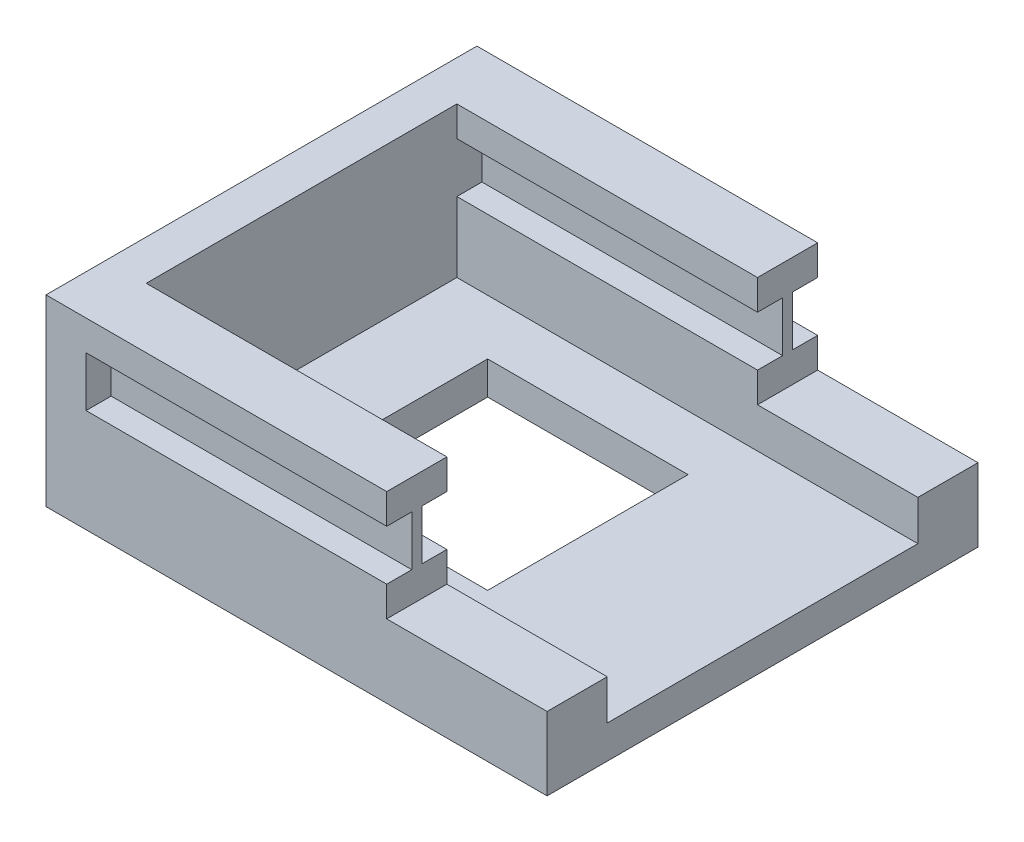
ISO-10303-21;
HEADER;
FILE_DESCRIPTION(('STEP AP214'),'2;1');
FILE_NAME('part.step','',(''),(''),'','','');
FILE_SCHEMA(('AUTOMOTIVE_DESIGN { 1 0 10303 214 1 1 1 1 }'));
ENDSEC;
DATA;
#1=APPLICATION_CONTEXT('core data for automotive mechanical design processes');
#2=APPLICATION_PROTOCOL_DEFINITION('international standard','automotive_design',2000,#1);
#3=PRODUCT_CONTEXT('',#1,'mechanical');
#4=PRODUCT('Part','Part','',(#3));
#5=PRODUCT_RELATED_PRODUCT_CATEGORY('part','',(#4));
#6=PRODUCT_DEFINITION_FORMATION('','',#4);
#7=PRODUCT_DEFINITION_CONTEXT('part definition',#1,'design');
#8=PRODUCT_DEFINITION('design','',#6,#7);
#9=PRODUCT_DEFINITION_SHAPE('','',#8);
#10=(LENGTH_UNIT() NAMED_UNIT(*) SI_UNIT(.MILLI.,.METRE.));
#11=(NAMED_UNIT(*) PLANE_ANGLE_UNIT() SI_UNIT($,.RADIAN.));
#12=(NAMED_UNIT(*) SI_UNIT($,.STERADIAN.) SOLID_ANGLE_UNIT());
#13=UNCERTAINTY_MEASURE_WITH_UNIT(LENGTH_MEASURE(1.E-05),#10,'distance_accuracy_value','');
#14=(GEOMETRIC_REPRESENTATION_CONTEXT(3) GLOBAL_UNCERTAINTY_ASSIGNED_CONTEXT((#13)) GLOBAL_UNIT_ASSIGNED_CONTEXT((#10,
#11,#12)) REPRESENTATION_CONTEXT('',''));
#15=CARTESIAN_POINT('',(0.,0.,0.));
#16=DIRECTION('',(0.,0.,1.));
#17=DIRECTION('',(1.,0.,0.));
#18=AXIS2_PLACEMENT_3D('',#15,#16,#17);
#19=CARTESIAN_POINT('',(5.,15.,43.));
#20=DIRECTION('',(1.,0.,0.));
#21=DIRECTION('',(0.,1.,0.));
#22=AXIS2_PLACEMENT_3D('',#19,#20,#21);
#23=PLANE('',#22);
#24=DIRECTION('',(0.,0.,1.));
#25=VECTOR('',#24,1.);
#26=CARTESIAN_POINT('',(5.,6.99999999999999,0.));
#27=LINE('',#26,#25);
#28=CARTESIAN_POINT('',(5.,7.,37.));
#29=VERTEX_POINT('',#28);
#30=CARTESIAN_POINT('',(5.,7.,39.5));
#31=VERTEX_POINT('',#30);
#32=EDGE_CURVE('E461',#29,#31,#27,.T.);
#33=ORIENTED_EDGE('',*,*,#32,.F.);
#34=DIRECTION('',(0.,-1.,0.));
#35=VECTOR('',#34,1.);
#36=CARTESIAN_POINT('',(5.,4.,37.));
#37=LINE('',#36,#35);
#38=CARTESIAN_POINT('',(5.,0.,37.));
#39=VERTEX_POINT('',#38);
#40=EDGE_CURVE('E62',#29,#39,#37,.T.);
#41=ORIENTED_EDGE('',*,*,#40,.T.);
#42=DIRECTION('',(0.,0.,1.));
#43=VECTOR('',#42,1.);
#44=CARTESIAN_POINT('',(5.,0.,6.));
#45=LINE('',#44,#43);
#46=CARTESIAN_POINT('',(5.,0.,6.));
#47=VERTEX_POINT('',#46);
#48=EDGE_CURVE('E288',#47,#39,#45,.T.);
#49=ORIENTED_EDGE('',*,*,#48,.F.);
#50=DIRECTION('',(0.,-1.,0.));
#51=VECTOR('',#50,1.);
#52=CARTESIAN_POINT('',(5.,4.,6.));
#53=LINE('',#52,#51);
#54=CARTESIAN_POINT('',(5.,7.,6.));
#55=VERTEX_POINT('',#54);
#56=EDGE_CURVE('E443',#55,#47,#53,.T.);
#57=ORIENTED_EDGE('',*,*,#56,.F.);
#58=DIRECTION('',(0.,0.,-1.));
#59=VECTOR('',#58,1.);
#60=CARTESIAN_POINT('',(5.,7.,0.));
#61=LINE('',#60,#59);
#62=CARTESIAN_POINT('',(5.,7.,3.5));
#63=VERTEX_POINT('',#62);
#64=EDGE_CURVE('E354',#55,#63,#61,.T.);
#65=ORIENTED_EDGE('',*,*,#64,.T.);
#66=DIRECTION('',(0.,1.,0.));
#67=VECTOR('',#66,1.);
#68=CARTESIAN_POINT('',(5.,0.,3.5));
#69=LINE('',#68,#67);
#70=CARTESIAN_POINT('',(5.,12.,3.5));
#71=VERTEX_POINT('',#70);
#72=EDGE_CURVE('E351',#63,#71,#69,.T.);
#73=ORIENTED_EDGE('',*,*,#72,.T.);
#74=DIRECTION('',(0.,0.,1.));
#75=VECTOR('',#74,1.);
#76=CARTESIAN_POINT('',(5.,12.,0.));
#77=LINE('',#76,#75);
#78=CARTESIAN_POINT('',(5.,12.,6.));
#79=VERTEX_POINT('',#78);
#80=EDGE_CURVE('E343',#71,#79,#77,.T.);
#81=ORIENTED_EDGE('',*,*,#80,.T.);
#82=DIRECTION('',(0.,-1.,0.));
#83=VECTOR('',#82,1.);
#84=CARTESIAN_POINT('',(5.,0.,6.));
#85=LINE('',#84,#83);
#86=CARTESIAN_POINT('',(5.,15.,6.));
#87=VERTEX_POINT('',#86);
#88=EDGE_CURVE('E341',#87,#79,#85,.T.);
#89=ORIENTED_EDGE('',*,*,#88,.F.);
#90=DIRECTION('',(0.,0.,-1.));
#91=VECTOR('',#90,1.);
#92=CARTESIAN_POINT('',(5.,15.,43.));
#93=LINE('',#92,#91);
#94=CARTESIAN_POINT('',(5.,15.,37.));
#95=VERTEX_POINT('',#94);
#96=EDGE_CURVE('E11',#95,#87,#93,.T.);
#97=ORIENTED_EDGE('',*,*,#96,.F.);
#98=DIRECTION('',(0.,-1.,0.));
#99=VECTOR('',#98,1.);
#100=CARTESIAN_POINT('',(5.,0.,37.));
#101=LINE('',#100,#99);
#102=CARTESIAN_POINT('',(5.,12.,37.));
#103=VERTEX_POINT('',#102);
#104=EDGE_CURVE('E515',#95,#103,#101,.T.);
#105=ORIENTED_EDGE('',*,*,#104,.T.);
#106=DIRECTION('',(0.,0.,-1.));
#107=VECTOR('',#106,1.);
#108=CARTESIAN_POINT('',(5.,12.,0.));
#109=LINE('',#108,#107);
#110=CARTESIAN_POINT('',(5.,12.,39.5));
#111=VERTEX_POINT('',#110);
#112=EDGE_CURVE('E512',#111,#103,#109,.T.);
#113=ORIENTED_EDGE('',*,*,#112,.F.);
#114=DIRECTION('',(0.,1.,0.));
#115=VECTOR('',#114,1.);
#116=CARTESIAN_POINT('',(5.,0.,39.5));
#117=LINE('',#116,#115);
#118=EDGE_CURVE('E464',#31,#111,#117,.T.);
#119=ORIENTED_EDGE('',*,*,#118,.F.);
#120=EDGE_LOOP('',(#33,#41,#49,#57,#65,#73,#81,#89,#97,#105,#113,#119));
#121=FACE_BOUND('',#120,.T.);
#122=ADVANCED_FACE('F37',(#121),#23,.T.);
#123=DIRECTION('',(0.,-1.,0.));
#124=VECTOR('',#123,1.);
#125=CARTESIAN_POINT('',(5.,0.,40.5));
#126=LINE('',#125,#124);
#127=CARTESIAN_POINT('',(5.,12.,40.5));
#128=VERTEX_POINT('',#127);
#129=CARTESIAN_POINT('',(5.,7.,40.5));
#130=VERTEX_POINT('',#129);
#131=EDGE_CURVE('E520',#128,#130,#126,.T.);
#132=ORIENTED_EDGE('',*,*,#131,.F.);
#133=DIRECTION('',(0.,0.,-1.));
#134=VECTOR('',#133,1.);
#135=CARTESIAN_POINT('',(5.,12.,0.));
#136=LINE('',#135,#134);
#137=CARTESIAN_POINT('',(5.,12.,43.));
#138=VERTEX_POINT('',#137);
#139=EDGE_CURVE('E517',#138,#128,#136,.T.);
#140=ORIENTED_EDGE('',*,*,#139,.F.);
#141=DIRECTION('',(0.,-1.,0.));
#142=VECTOR('',#141,1.);
#143=CARTESIAN_POINT('',(5.,15.,43.));
#144=LINE('',#143,#142);
#145=CARTESIAN_POINT('',(5.,7.,43.));
#146=VERTEX_POINT('',#145);
#147=EDGE_CURVE('E272',#138,#146,#144,.T.);
#148=ORIENTED_EDGE('',*,*,#147,.T.);
#149=DIRECTION('',(0.,0.,1.));
#150=VECTOR('',#149,1.);
#151=CARTESIAN_POINT('',(5.,7.,0.));
#152=LINE('',#151,#150);
#153=EDGE_CURVE('E362',#130,#146,#152,.T.);
#154=ORIENTED_EDGE('',*,*,#153,.F.);
#155=EDGE_LOOP('',(#132,#140,#148,#154));
#156=FACE_BOUND('',#155,.T.);
#157=ADVANCED_FACE('F319',(#156),#23,.T.);
#158=CARTESIAN_POINT('',(5.,4.,43.));
#159=DIRECTION('',(0.,1.,0.));
#160=DIRECTION('',(-1.,0.,0.));
#161=AXIS2_PLACEMENT_3D('',#158,#159,#160);
#162=PLANE('',#161);
#163=DIRECTION('',(0.,0.,-1.));
#164=VECTOR('',#163,1.);
#165=CARTESIAN_POINT('',(51.,4.,43.001));
#166=LINE('',#165,#164);
#167=CARTESIAN_POINT('',(51.,4.,6.));
#168=VERTEX_POINT('',#167);
#169=CARTESIAN_POINT('',(51.,4.,0.));
#170=VERTEX_POINT('',#169);
#171=EDGE_CURVE('E255',#168,#170,#166,.T.);
#172=ORIENTED_EDGE('',*,*,#171,.T.);
#173=DIRECTION('',(1.,0.,0.));
#174=VECTOR('',#173,1.);
#175=CARTESIAN_POINT('',(5.,4.,0.));
#176=LINE('',#175,#174);
#177=CARTESIAN_POINT('',(35.,4.,0.));
#178=VERTEX_POINT('',#177);
#179=EDGE_CURVE('E287',#178,#170,#176,.T.);
#180=ORIENTED_EDGE('',*,*,#179,.F.);
#181=DIRECTION('',(0.,0.,1.));
#182=VECTOR('',#181,1.);
#183=CARTESIAN_POINT('',(35.,4.,0.));
#184=LINE('',#183,#182);
#185=CARTESIAN_POINT('',(35.,4.,6.));
#186=VERTEX_POINT('',#185);
#187=EDGE_CURVE('E365',#178,#186,#184,.T.);
#188=ORIENTED_EDGE('',*,*,#187,.T.);
#189=DIRECTION('',(-1.,0.,0.));
#190=VECTOR('',#189,1.);
#191=CARTESIAN_POINT('',(5.,4.,6.));
#192=LINE('',#191,#190);
#193=EDGE_CURVE('E450',#168,#186,#192,.T.);
#194=ORIENTED_EDGE('',*,*,#193,.F.);
#195=EDGE_LOOP('',(#172,#180,#188,#194));
#196=FACE_BOUND('',#195,.T.);
#197=ADVANCED_FACE('F324',(#196),#162,.T.);
#198=DIRECTION('',(0.,0.,1.));
#199=VECTOR('',#198,1.);
#200=CARTESIAN_POINT('',(5.,12.,0.));
#201=LINE('',#200,#199);
#202=CARTESIAN_POINT('',(5.,12.,0.));
#203=VERTEX_POINT('',#202);
#204=CARTESIAN_POINT('',(5.,12.,2.5));
#205=VERTEX_POINT('',#204);
#206=EDGE_CURVE('E335',#203,#205,#201,.T.);
#207=ORIENTED_EDGE('',*,*,#206,.T.);
#208=DIRECTION('',(0.,-1.,0.));
#209=VECTOR('',#208,1.);
#210=CARTESIAN_POINT('',(5.,0.,2.5));
#211=LINE('',#210,#209);
#212=CARTESIAN_POINT('',(5.,7.,2.5));
#213=VERTEX_POINT('',#212);
#214=EDGE_CURVE('E337',#205,#213,#211,.T.);
#215=ORIENTED_EDGE('',*,*,#214,.T.);
#216=DIRECTION('',(0.,0.,-1.));
#217=VECTOR('',#216,1.);
#218=CARTESIAN_POINT('',(5.,7.,0.));
#219=LINE('',#218,#217);
#220=CARTESIAN_POINT('',(5.,7.,0.));
#221=VERTEX_POINT('',#220);
#222=EDGE_CURVE('E345',#213,#221,#219,.T.);
#223=ORIENTED_EDGE('',*,*,#222,.T.);
#224=DIRECTION('',(0.,-1.,0.));
#225=VECTOR('',#224,1.);
#226=CARTESIAN_POINT('',(5.,15.,0.));
#227=LINE('',#226,#225);
#228=EDGE_CURVE('E284',#203,#221,#227,.T.);
#229=ORIENTED_EDGE('',*,*,#228,.F.);
#230=EDGE_LOOP('',(#207,#215,#223,#229));
#231=FACE_BOUND('',#230,.T.);
#232=ADVANCED_FACE('F39',(#231),#23,.T.);
#233=CARTESIAN_POINT('',(1.,15.,43.));
#234=DIRECTION('',(0.,1.,0.));
#235=DIRECTION('',(0.,0.,1.));
#236=AXIS2_PLACEMENT_3D('',#233,#234,#235);
#237=PLANE('',#236);
#238=DIRECTION('',(1.,0.,0.));
#239=VECTOR('',#238,1.);
#240=CARTESIAN_POINT('',(1.,15.,0.));
#241=LINE('',#240,#239);
#242=CARTESIAN_POINT('',(1.,15.,0.));
#243=VERTEX_POINT('',#242);
#244=CARTESIAN_POINT('',(35.,15.,0.));
#245=VERTEX_POINT('',#244);
#246=EDGE_CURVE('E276',#243,#245,#241,.T.);
#247=ORIENTED_EDGE('',*,*,#246,.F.);
#248=DIRECTION('',(0.,0.,-1.));
#249=VECTOR('',#248,1.);
#250=CARTESIAN_POINT('',(1.,15.,43.));
#251=LINE('',#250,#249);
#252=CARTESIAN_POINT('',(1.,15.,43.));
#253=VERTEX_POINT('',#252);
#254=EDGE_CURVE('E46',#253,#243,#251,.T.);
#255=ORIENTED_EDGE('',*,*,#254,.F.);
#256=DIRECTION('',(1.,0.,0.));
#257=VECTOR('',#256,1.);
#258=CARTESIAN_POINT('',(1.,15.,43.));
#259=LINE('',#258,#257);
#260=CARTESIAN_POINT('',(35.,15.,43.));
#261=VERTEX_POINT('',#260);
#262=EDGE_CURVE('E282',#253,#261,#259,.T.);
#263=ORIENTED_EDGE('',*,*,#262,.T.);
#264=DIRECTION('',(0.,0.,1.));
#265=VECTOR('',#264,1.);
#266=CARTESIAN_POINT('',(35.,15.,0.));
#267=LINE('',#266,#265);
#268=CARTESIAN_POINT('',(35.,15.,37.));
#269=VERTEX_POINT('',#268);
#270=EDGE_CURVE('E539',#269,#261,#267,.T.);
#271=ORIENTED_EDGE('',*,*,#270,.F.);
#272=DIRECTION('',(1.,0.,0.));
#273=VECTOR('',#272,1.);
#274=CARTESIAN_POINT('',(-7.52996408614167,15.,37.));
#275=LINE('',#274,#273);
#276=EDGE_CURVE('E557',#95,#269,#275,.T.);
#277=ORIENTED_EDGE('',*,*,#276,.F.);
#278=ORIENTED_EDGE('',*,*,#96,.T.);
#279=DIRECTION('',(1.,0.,0.));
#280=VECTOR('',#279,1.);
#281=CARTESIAN_POINT('',(-7.52996408614167,15.,6.));
#282=LINE('',#281,#280);
#283=CARTESIAN_POINT('',(35.,15.,6.));
#284=VERTEX_POINT('',#283);
#285=EDGE_CURVE('E402',#87,#284,#282,.T.);
#286=ORIENTED_EDGE('',*,*,#285,.T.);
#287=DIRECTION('',(0.,0.,-1.));
#288=VECTOR('',#287,1.);
#289=CARTESIAN_POINT('',(35.,15.,0.));
#290=LINE('',#289,#288);
#291=EDGE_CURVE('E383',#284,#245,#290,.T.);
#292=ORIENTED_EDGE('',*,*,#291,.T.);
#293=EDGE_LOOP('',(#247,#255,#263,#271,#277,#278,#286,#292));
#294=FACE_BOUND('',#293,.T.);
#295=ADVANCED_FACE('F308',(#294),#237,.T.);
#296=CARTESIAN_POINT('',(1.,-3.3,43.));
#297=DIRECTION('',(-1.,0.,0.));
#298=DIRECTION('',(0.,0.,1.));
#299=AXIS2_PLACEMENT_3D('',#296,#297,#298);
#300=PLANE('',#299);
#301=DIRECTION('',(0.,1.,0.));
#302=VECTOR('',#301,1.);
#303=CARTESIAN_POINT('',(1.,-3.3,0.));
#304=LINE('',#303,#302);
#305=CARTESIAN_POINT('',(1.,-3.3,0.));
#306=VERTEX_POINT('',#305);
#307=EDGE_CURVE('E294',#306,#243,#304,.T.);
#308=ORIENTED_EDGE('',*,*,#307,.F.);
#309=DIRECTION('',(0.,0.,-1.));
#310=VECTOR('',#309,1.);
#311=CARTESIAN_POINT('',(1.,-3.3,43.));
#312=LINE('',#311,#310);
#313=CARTESIAN_POINT('',(1.,-3.3,43.));
#314=VERTEX_POINT('',#313);
#315=EDGE_CURVE('E41',#314,#306,#312,.T.);
#316=ORIENTED_EDGE('',*,*,#315,.F.);
#317=DIRECTION('',(0.,1.,0.));
#318=VECTOR('',#317,1.);
#319=CARTESIAN_POINT('',(1.,-3.3,43.));
#320=LINE('',#319,#318);
#321=EDGE_CURVE('E274',#314,#253,#320,.T.);
#322=ORIENTED_EDGE('',*,*,#321,.T.);
#323=ORIENTED_EDGE('',*,*,#254,.T.);
#324=EDGE_LOOP('',(#308,#316,#322,#323));
#325=FACE_BOUND('',#324,.T.);
#326=ADVANCED_FACE('F306',(#325),#300,.T.);
#327=CARTESIAN_POINT('',(1.,-3.3,43.));
#328=DIRECTION('',(0.,1.,0.));
#329=DIRECTION('',(0.,0.,1.));
#330=AXIS2_PLACEMENT_3D('',#327,#328,#329);
#331=PLANE('',#330);
#332=DIRECTION('',(-1.,0.,0.));
#333=VECTOR('',#332,1.);
#334=CARTESIAN_POINT('',(13.57,-3.3,31.5));
#335=LINE('',#334,#333);
#336=CARTESIAN_POINT('',(33.57,-3.3,31.5));
#337=VERTEX_POINT('',#336);
#338=CARTESIAN_POINT('',(13.57,-3.3,31.5));
#339=VERTEX_POINT('',#338);
#340=EDGE_CURVE('E414',#337,#339,#335,.T.);
#341=ORIENTED_EDGE('',*,*,#340,.F.);
#342=DIRECTION('',(0.,0.,1.));
#343=VECTOR('',#342,1.);
#344=CARTESIAN_POINT('',(33.57,-3.3,11.5));
#345=LINE('',#344,#343);
#346=CARTESIAN_POINT('',(33.57,-3.3,11.5));
#347=VERTEX_POINT('',#346);
#348=EDGE_CURVE('E417',#347,#337,#345,.T.);
#349=ORIENTED_EDGE('',*,*,#348,.F.);
#350=DIRECTION('',(1.,0.,0.));
#351=VECTOR('',#350,1.);
#352=CARTESIAN_POINT('',(13.57,-3.3,11.5));
#353=LINE('',#352,#351);
#354=CARTESIAN_POINT('',(13.57,-3.3,11.5));
#355=VERTEX_POINT('',#354);
#356=EDGE_CURVE('E434',#355,#347,#353,.T.);
#357=ORIENTED_EDGE('',*,*,#356,.F.);
#358=DIRECTION('',(0.,0.,-1.));
#359=VECTOR('',#358,1.);
#360=CARTESIAN_POINT('',(13.57,-3.3,11.5));
#361=LINE('',#360,#359);
#362=EDGE_CURVE('E357',#339,#355,#361,.T.);
#363=ORIENTED_EDGE('',*,*,#362,.F.);
#364=EDGE_LOOP('',(#341,#349,#357,#363));
#365=FACE_BOUND('',#364,.T.);
#366=DIRECTION('',(1.,0.,0.));
#367=VECTOR('',#366,1.);
#368=CARTESIAN_POINT('',(1.,-3.3,0.));
#369=LINE('',#368,#367);
#370=CARTESIAN_POINT('',(51.,-3.3,0.));
#371=VERTEX_POINT('',#370);
#372=EDGE_CURVE('E291',#306,#371,#369,.T.);
#373=ORIENTED_EDGE('',*,*,#372,.T.);
#374=DIRECTION('',(0.,0.,-1.));
#375=VECTOR('',#374,1.);
#376=CARTESIAN_POINT('',(51.,-3.3,43.001));
#377=LINE('',#376,#375);
#378=CARTESIAN_POINT('',(51.,-3.3,43.));
#379=VERTEX_POINT('',#378);
#380=EDGE_CURVE('E502',#379,#371,#377,.T.);
#381=ORIENTED_EDGE('',*,*,#380,.F.);
#382=DIRECTION('',(1.,0.,0.));
#383=VECTOR('',#382,1.);
#384=CARTESIAN_POINT('',(1.,-3.3,43.));
#385=LINE('',#384,#383);
#386=EDGE_CURVE('E266',#314,#379,#385,.T.);
#387=ORIENTED_EDGE('',*,*,#386,.F.);
#388=ORIENTED_EDGE('',*,*,#315,.T.);
#389=EDGE_LOOP('',(#373,#381,#387,#388));
#390=FACE_BOUND('',#389,.T.);
#391=ADVANCED_FACE('F301',(#365,#390),#331,.F.);
#392=CARTESIAN_POINT('',(51.,4.,43.));
#393=VERTEX_POINT('',#392);
#394=CARTESIAN_POINT('',(51.,4.,37.));
#395=VERTEX_POINT('',#394);
#396=EDGE_CURVE('E246',#393,#395,#166,.T.);
#397=ORIENTED_EDGE('',*,*,#396,.T.);
#398=DIRECTION('',(-1.,0.,0.));
#399=VECTOR('',#398,1.);
#400=CARTESIAN_POINT('',(5.,4.,37.));
#401=LINE('',#400,#399);
#402=CARTESIAN_POINT('',(35.,4.,37.));
#403=VERTEX_POINT('',#402);
#404=EDGE_CURVE('E447',#395,#403,#401,.T.);
#405=ORIENTED_EDGE('',*,*,#404,.T.);
#406=DIRECTION('',(0.,0.,1.));
#407=VECTOR('',#406,1.);
#408=CARTESIAN_POINT('',(35.,4.,0.));
#409=LINE('',#408,#407);
#410=CARTESIAN_POINT('',(35.,4.,43.));
#411=VERTEX_POINT('',#410);
#412=EDGE_CURVE('E271',#403,#411,#409,.T.);
#413=ORIENTED_EDGE('',*,*,#412,.T.);
#414=DIRECTION('',(1.,0.,0.));
#415=VECTOR('',#414,1.);
#416=CARTESIAN_POINT('',(5.,4.,43.));
#417=LINE('',#416,#415);
#418=EDGE_CURVE('E262',#411,#393,#417,.T.);
#419=ORIENTED_EDGE('',*,*,#418,.T.);
#420=EDGE_LOOP('',(#397,#405,#413,#419));
#421=FACE_BOUND('',#420,.T.);
#422=ADVANCED_FACE('F269',(#421),#162,.T.);
#423=CARTESIAN_POINT('',(0.,0.,43.));
#424=DIRECTION('',(0.,0.,1.));
#425=DIRECTION('',(1.,0.,0.));
#426=AXIS2_PLACEMENT_3D('',#423,#424,#425);
#427=PLANE('',#426);
#428=DIRECTION('',(0.,1.,0.));
#429=VECTOR('',#428,1.);
#430=CARTESIAN_POINT('',(51.,4.,43.));
#431=LINE('',#430,#429);
#432=EDGE_CURVE('E249',#379,#393,#431,.T.);
#433=ORIENTED_EDGE('',*,*,#432,.T.);
#434=ORIENTED_EDGE('',*,*,#418,.F.);
#435=DIRECTION('',(0.,1.,0.));
#436=VECTOR('',#435,1.);
#437=CARTESIAN_POINT('',(35.,0.,43.));
#438=LINE('',#437,#436);
#439=CARTESIAN_POINT('',(35.,7.,43.));
#440=VERTEX_POINT('',#439);
#441=EDGE_CURVE('E509',#411,#440,#438,.T.);
#442=ORIENTED_EDGE('',*,*,#441,.T.);
#443=DIRECTION('',(1.,0.,0.));
#444=VECTOR('',#443,1.);
#445=CARTESIAN_POINT('',(-7.52996408614167,7.,43.));
#446=LINE('',#445,#444);
#447=EDGE_CURVE('E467',#146,#440,#446,.T.);
#448=ORIENTED_EDGE('',*,*,#447,.F.);
#449=ORIENTED_EDGE('',*,*,#147,.F.);
#450=DIRECTION('',(1.,0.,0.));
#451=VECTOR('',#450,1.);
#452=CARTESIAN_POINT('',(-7.52996408614167,12.,43.));
#453=LINE('',#452,#451);
#454=CARTESIAN_POINT('',(35.,12.,43.));
#455=VERTEX_POINT('',#454);
#456=EDGE_CURVE('E555',#138,#455,#453,.T.);
#457=ORIENTED_EDGE('',*,*,#456,.T.);
#458=DIRECTION('',(0.,-1.,0.));
#459=VECTOR('',#458,1.);
#460=CARTESIAN_POINT('',(35.,0.,43.));
#461=LINE('',#460,#459);
#462=EDGE_CURVE('E542',#261,#455,#461,.T.);
#463=ORIENTED_EDGE('',*,*,#462,.F.);
#464=ORIENTED_EDGE('',*,*,#262,.F.);
#465=ORIENTED_EDGE('',*,*,#321,.F.);
#466=ORIENTED_EDGE('',*,*,#386,.T.);
#467=EDGE_LOOP('',(#433,#434,#442,#448,#449,#457,#463,#464,#465,#466));
#468=FACE_BOUND('',#467,.T.);
#469=ADVANCED_FACE('F260',(#468),#427,.T.);
#470=CARTESIAN_POINT('',(0.,0.,0.));
#471=DIRECTION('',(0.,0.,1.));
#472=DIRECTION('',(1.,0.,0.));
#473=AXIS2_PLACEMENT_3D('',#470,#471,#472);
#474=PLANE('',#473);
#475=ORIENTED_EDGE('',*,*,#179,.T.);
#476=DIRECTION('',(0.,1.,0.));
#477=VECTOR('',#476,1.);
#478=CARTESIAN_POINT('',(51.,4.,0.));
#479=LINE('',#478,#477);
#480=EDGE_CURVE('E267',#371,#170,#479,.T.);
#481=ORIENTED_EDGE('',*,*,#480,.F.);
#482=ORIENTED_EDGE('',*,*,#372,.F.);
#483=ORIENTED_EDGE('',*,*,#307,.T.);
#484=ORIENTED_EDGE('',*,*,#246,.T.);
#485=DIRECTION('',(0.,-1.,0.));
#486=VECTOR('',#485,1.);
#487=CARTESIAN_POINT('',(35.,0.,0.));
#488=LINE('',#487,#486);
#489=CARTESIAN_POINT('',(35.,12.,0.));
#490=VERTEX_POINT('',#489);
#491=EDGE_CURVE('E380',#245,#490,#488,.T.);
#492=ORIENTED_EDGE('',*,*,#491,.T.);
#493=DIRECTION('',(1.,0.,0.));
#494=VECTOR('',#493,1.);
#495=CARTESIAN_POINT('',(-7.52996408614167,12.,0.));
#496=LINE('',#495,#494);
#497=EDGE_CURVE('E404',#203,#490,#496,.T.);
#498=ORIENTED_EDGE('',*,*,#497,.F.);
#499=ORIENTED_EDGE('',*,*,#228,.T.);
#500=DIRECTION('',(1.,0.,0.));
#501=VECTOR('',#500,1.);
#502=CARTESIAN_POINT('',(-7.52996408614167,7.,0.));
#503=LINE('',#502,#501);
#504=CARTESIAN_POINT('',(35.,7.,0.));
#505=VERTEX_POINT('',#504);
#506=EDGE_CURVE('E410',#221,#505,#503,.T.);
#507=ORIENTED_EDGE('',*,*,#506,.T.);
#508=DIRECTION('',(0.,1.,0.));
#509=VECTOR('',#508,1.);
#510=CARTESIAN_POINT('',(35.,0.,0.));
#511=LINE('',#510,#509);
#512=EDGE_CURVE('E368',#178,#505,#511,.T.);
#513=ORIENTED_EDGE('',*,*,#512,.F.);
#514=EDGE_LOOP('',(#475,#481,#482,#483,#484,#492,#498,#499,#507,#513));
#515=FACE_BOUND('',#514,.T.);
#516=ADVANCED_FACE('F304',(#515),#474,.F.);
#517=CARTESIAN_POINT('',(5.,0.,6.));
#518=DIRECTION('',(0.,-1.,0.));
#519=DIRECTION('',(0.,0.,-1.));
#520=AXIS2_PLACEMENT_3D('',#517,#518,#519);
#521=PLANE('',#520);
#522=DIRECTION('',(-1.,0.,0.));
#523=VECTOR('',#522,1.);
#524=CARTESIAN_POINT('',(13.57,0.,11.5));
#525=LINE('',#524,#523);
#526=CARTESIAN_POINT('',(33.57,0.,11.5));
#527=VERTEX_POINT('',#526);
#528=CARTESIAN_POINT('',(13.57,0.,11.5));
#529=VERTEX_POINT('',#528);
#530=EDGE_CURVE('E422',#527,#529,#525,.T.);
#531=ORIENTED_EDGE('',*,*,#530,.F.);
#532=DIRECTION('',(0.,0.,-1.));
#533=VECTOR('',#532,1.);
#534=CARTESIAN_POINT('',(33.57,0.,11.5));
#535=LINE('',#534,#533);
#536=CARTESIAN_POINT('',(33.57,0.,31.5));
#537=VERTEX_POINT('',#536);
#538=EDGE_CURVE('E420',#537,#527,#535,.T.);
#539=ORIENTED_EDGE('',*,*,#538,.F.);
#540=DIRECTION('',(1.,0.,0.));
#541=VECTOR('',#540,1.);
#542=CARTESIAN_POINT('',(13.57,0.,31.5));
#543=LINE('',#542,#541);
#544=CARTESIAN_POINT('',(13.57,0.,31.5));
#545=VERTEX_POINT('',#544);
#546=EDGE_CURVE('E428',#545,#537,#543,.T.);
#547=ORIENTED_EDGE('',*,*,#546,.F.);
#548=DIRECTION('',(0.,0.,1.));
#549=VECTOR('',#548,1.);
#550=CARTESIAN_POINT('',(13.57,0.,11.5));
#551=LINE('',#550,#549);
#552=EDGE_CURVE('E425',#529,#545,#551,.T.);
#553=ORIENTED_EDGE('',*,*,#552,.F.);
#554=EDGE_LOOP('',(#531,#539,#547,#553));
#555=FACE_BOUND('',#554,.T.);
#556=DIRECTION('',(1.,0.,0.));
#557=VECTOR('',#556,1.);
#558=CARTESIAN_POINT('',(5.,0.,37.));
#559=LINE('',#558,#557);
#560=CARTESIAN_POINT('',(51.,0.,37.));
#561=VERTEX_POINT('',#560);
#562=EDGE_CURVE('E453',#39,#561,#559,.T.);
#563=ORIENTED_EDGE('',*,*,#562,.T.);
#564=DIRECTION('',(0.,0.,1.));
#565=VECTOR('',#564,1.);
#566=CARTESIAN_POINT('',(51.,0.,43.001));
#567=LINE('',#566,#565);
#568=CARTESIAN_POINT('',(51.,0.,6.));
#569=VERTEX_POINT('',#568);
#570=EDGE_CURVE('E54',#569,#561,#567,.T.);
#571=ORIENTED_EDGE('',*,*,#570,.F.);
#572=DIRECTION('',(1.,0.,0.));
#573=VECTOR('',#572,1.);
#574=CARTESIAN_POINT('',(5.,0.,6.));
#575=LINE('',#574,#573);
#576=EDGE_CURVE('E446',#47,#569,#575,.T.);
#577=ORIENTED_EDGE('',*,*,#576,.F.);
#578=ORIENTED_EDGE('',*,*,#48,.T.);
#579=EDGE_LOOP('',(#563,#571,#577,#578));
#580=FACE_BOUND('',#579,.T.);
#581=ADVANCED_FACE('F458',(#555,#580),#521,.F.);
#582=CARTESIAN_POINT('',(0.,0.,6.));
#583=DIRECTION('',(0.,0.,1.));
#584=DIRECTION('',(1.,0.,0.));
#585=AXIS2_PLACEMENT_3D('',#582,#583,#584);
#586=PLANE('',#585);
#587=DIRECTION('',(0.,1.,0.));
#588=VECTOR('',#587,1.);
#589=CARTESIAN_POINT('',(51.,4.,6.));
#590=LINE('',#589,#588);
#591=EDGE_CURVE('E508',#569,#168,#590,.T.);
#592=ORIENTED_EDGE('',*,*,#591,.T.);
#593=ORIENTED_EDGE('',*,*,#193,.T.);
#594=DIRECTION('',(0.,-1.,0.));
#595=VECTOR('',#594,1.);
#596=CARTESIAN_POINT('',(35.,0.,6.));
#597=LINE('',#596,#595);
#598=CARTESIAN_POINT('',(35.,7.,6.));
#599=VERTEX_POINT('',#598);
#600=EDGE_CURVE('E361',#599,#186,#597,.T.);
#601=ORIENTED_EDGE('',*,*,#600,.F.);
#602=DIRECTION('',(1.,0.,0.));
#603=VECTOR('',#602,1.);
#604=CARTESIAN_POINT('',(-7.52996408614167,7.,6.));
#605=LINE('',#604,#603);
#606=EDGE_CURVE('E395',#55,#599,#605,.T.);
#607=ORIENTED_EDGE('',*,*,#606,.F.);
#608=ORIENTED_EDGE('',*,*,#56,.T.);
#609=ORIENTED_EDGE('',*,*,#576,.T.);
#610=EDGE_LOOP('',(#592,#593,#601,#607,#608,#609));
#611=FACE_BOUND('',#610,.T.);
#612=ADVANCED_FACE('F609',(#611),#586,.T.);
#613=CARTESIAN_POINT('',(0.,0.,37.));
#614=DIRECTION('',(0.,0.,1.));
#615=DIRECTION('',(1.,0.,0.));
#616=AXIS2_PLACEMENT_3D('',#613,#614,#615);
#617=PLANE('',#616);
#618=ORIENTED_EDGE('',*,*,#404,.F.);
#619=DIRECTION('',(0.,1.,0.));
#620=VECTOR('',#619,1.);
#621=CARTESIAN_POINT('',(51.,4.,37.));
#622=LINE('',#621,#620);
#623=EDGE_CURVE('E251',#561,#395,#622,.T.);
#624=ORIENTED_EDGE('',*,*,#623,.F.);
#625=ORIENTED_EDGE('',*,*,#562,.F.);
#626=ORIENTED_EDGE('',*,*,#40,.F.);
#627=DIRECTION('',(1.,0.,0.));
#628=VECTOR('',#627,1.);
#629=CARTESIAN_POINT('',(-7.52996408614167,7.,37.));
#630=LINE('',#629,#628);
#631=CARTESIAN_POINT('',(35.,7.,37.));
#632=VERTEX_POINT('',#631);
#633=EDGE_CURVE('E470',#29,#632,#630,.T.);
#634=ORIENTED_EDGE('',*,*,#633,.T.);
#635=DIRECTION('',(0.,-1.,0.));
#636=VECTOR('',#635,1.);
#637=CARTESIAN_POINT('',(35.,0.,37.));
#638=LINE('',#637,#636);
#639=EDGE_CURVE('E527',#632,#403,#638,.T.);
#640=ORIENTED_EDGE('',*,*,#639,.T.);
#641=EDGE_LOOP('',(#618,#624,#625,#626,#634,#640));
#642=FACE_BOUND('',#641,.T.);
#643=ADVANCED_FACE('F459',(#642),#617,.F.);
#644=CARTESIAN_POINT('',(33.57,-3.301,11.5));
#645=DIRECTION('',(1.,0.,0.));
#646=DIRECTION('',(0.,0.,-1.));
#647=AXIS2_PLACEMENT_3D('',#644,#645,#646);
#648=PLANE('',#647);
#649=ORIENTED_EDGE('',*,*,#348,.T.);
#650=DIRECTION('',(0.,1.,0.));
#651=VECTOR('',#650,1.);
#652=CARTESIAN_POINT('',(33.57,-3.301,31.5));
#653=LINE('',#652,#651);
#654=EDGE_CURVE('E432',#337,#537,#653,.T.);
#655=ORIENTED_EDGE('',*,*,#654,.T.);
#656=ORIENTED_EDGE('',*,*,#538,.T.);
#657=DIRECTION('',(0.,1.,0.));
#658=VECTOR('',#657,1.);
#659=CARTESIAN_POINT('',(33.57,-3.301,11.5));
#660=LINE('',#659,#658);
#661=EDGE_CURVE('E431',#347,#527,#660,.T.);
#662=ORIENTED_EDGE('',*,*,#661,.F.);
#663=EDGE_LOOP('',(#649,#655,#656,#662));
#664=FACE_BOUND('',#663,.T.);
#665=ADVANCED_FACE('F616',(#664),#648,.F.);
#666=CARTESIAN_POINT('',(13.57,-3.301,31.5));
#667=DIRECTION('',(0.,0.,1.));
#668=DIRECTION('',(1.,0.,0.));
#669=AXIS2_PLACEMENT_3D('',#666,#667,#668);
#670=PLANE('',#669);
#671=ORIENTED_EDGE('',*,*,#340,.T.);
#672=DIRECTION('',(0.,1.,0.));
#673=VECTOR('',#672,1.);
#674=CARTESIAN_POINT('',(13.57,-3.301,31.5));
#675=LINE('',#674,#673);
#676=EDGE_CURVE('E435',#339,#545,#675,.T.);
#677=ORIENTED_EDGE('',*,*,#676,.T.);
#678=ORIENTED_EDGE('',*,*,#546,.T.);
#679=ORIENTED_EDGE('',*,*,#654,.F.);
#680=EDGE_LOOP('',(#671,#677,#678,#679));
#681=FACE_BOUND('',#680,.T.);
#682=ADVANCED_FACE('F776',(#681),#670,.F.);
#683=CARTESIAN_POINT('',(13.57,-3.301,11.5));
#684=DIRECTION('',(-1.,0.,0.));
#685=DIRECTION('',(0.,0.,1.));
#686=AXIS2_PLACEMENT_3D('',#683,#684,#685);
#687=PLANE('',#686);
#688=ORIENTED_EDGE('',*,*,#362,.T.);
#689=DIRECTION('',(0.,1.,0.));
#690=VECTOR('',#689,1.);
#691=CARTESIAN_POINT('',(13.57,-3.301,11.5));
#692=LINE('',#691,#690);
#693=EDGE_CURVE('E437',#355,#529,#692,.T.);
#694=ORIENTED_EDGE('',*,*,#693,.T.);
#695=ORIENTED_EDGE('',*,*,#552,.T.);
#696=ORIENTED_EDGE('',*,*,#676,.F.);
#697=EDGE_LOOP('',(#688,#694,#695,#696));
#698=FACE_BOUND('',#697,.T.);
#699=ADVANCED_FACE('F769',(#698),#687,.F.);
#700=CARTESIAN_POINT('',(13.57,-3.301,11.5));
#701=DIRECTION('',(0.,0.,-1.));
#702=DIRECTION('',(-1.,0.,0.));
#703=AXIS2_PLACEMENT_3D('',#700,#701,#702);
#704=PLANE('',#703);
#705=ORIENTED_EDGE('',*,*,#356,.T.);
#706=ORIENTED_EDGE('',*,*,#661,.T.);
#707=ORIENTED_EDGE('',*,*,#530,.T.);
#708=ORIENTED_EDGE('',*,*,#693,.F.);
#709=EDGE_LOOP('',(#705,#706,#707,#708));
#710=FACE_BOUND('',#709,.T.);
#711=ADVANCED_FACE('F762',(#710),#704,.F.);
#712=CARTESIAN_POINT('',(-7.52996408614167,7.,0.));
#713=DIRECTION('',(0.,1.,0.));
#714=DIRECTION('',(0.,0.,1.));
#715=AXIS2_PLACEMENT_3D('',#712,#713,#714);
#716=PLANE('',#715);
#717=ORIENTED_EDGE('',*,*,#64,.F.);
#718=ORIENTED_EDGE('',*,*,#606,.T.);
#719=DIRECTION('',(0.,0.,1.));
#720=VECTOR('',#719,1.);
#721=CARTESIAN_POINT('',(35.,7.,0.));
#722=LINE('',#721,#720);
#723=CARTESIAN_POINT('',(35.,7.,3.5));
#724=VERTEX_POINT('',#723);
#725=EDGE_CURVE('E358',#724,#599,#722,.T.);
#726=ORIENTED_EDGE('',*,*,#725,.F.);
#727=DIRECTION('',(1.,0.,0.));
#728=VECTOR('',#727,1.);
#729=CARTESIAN_POINT('',(-7.52996408614167,7.,3.5));
#730=LINE('',#729,#728);
#731=EDGE_CURVE('E396',#63,#724,#730,.T.);
#732=ORIENTED_EDGE('',*,*,#731,.F.);
#733=EDGE_LOOP('',(#717,#718,#726,#732));
#734=FACE_BOUND('',#733,.T.);
#735=ADVANCED_FACE('F605',(#734),#716,.T.);
#736=CARTESIAN_POINT('',(-7.52996408614167,0.,3.5));
#737=DIRECTION('',(0.,0.,1.));
#738=DIRECTION('',(0.,-1.,0.));
#739=AXIS2_PLACEMENT_3D('',#736,#737,#738);
#740=PLANE('',#739);
#741=ORIENTED_EDGE('',*,*,#72,.F.);
#742=ORIENTED_EDGE('',*,*,#731,.T.);
#743=DIRECTION('',(0.,-1.,0.));
#744=VECTOR('',#743,1.);
#745=CARTESIAN_POINT('',(35.,0.,3.5));
#746=LINE('',#745,#744);
#747=CARTESIAN_POINT('',(35.,12.,3.5));
#748=VERTEX_POINT('',#747);
#749=EDGE_CURVE('E392',#748,#724,#746,.T.);
#750=ORIENTED_EDGE('',*,*,#749,.F.);
#751=DIRECTION('',(1.,0.,0.));
#752=VECTOR('',#751,1.);
#753=CARTESIAN_POINT('',(-7.52996408614167,12.,3.5));
#754=LINE('',#753,#752);
#755=EDGE_CURVE('E398',#71,#748,#754,.T.);
#756=ORIENTED_EDGE('',*,*,#755,.F.);
#757=EDGE_LOOP('',(#741,#742,#750,#756));
#758=FACE_BOUND('',#757,.T.);
#759=ADVANCED_FACE('F599',(#758),#740,.T.);
#760=CARTESIAN_POINT('',(-7.52996408614167,12.,0.));
#761=DIRECTION('',(0.,-1.,0.));
#762=DIRECTION('',(0.,0.,-1.));
#763=AXIS2_PLACEMENT_3D('',#760,#761,#762);
#764=PLANE('',#763);
#765=ORIENTED_EDGE('',*,*,#80,.F.);
#766=ORIENTED_EDGE('',*,*,#755,.T.);
#767=DIRECTION('',(0.,0.,-1.));
#768=VECTOR('',#767,1.);
#769=CARTESIAN_POINT('',(35.,12.,0.));
#770=LINE('',#769,#768);
#771=CARTESIAN_POINT('',(35.,12.,6.));
#772=VERTEX_POINT('',#771);
#773=EDGE_CURVE('E389',#772,#748,#770,.T.);
#774=ORIENTED_EDGE('',*,*,#773,.F.);
#775=DIRECTION('',(1.,0.,0.));
#776=VECTOR('',#775,1.);
#777=CARTESIAN_POINT('',(-7.52996408614167,12.,6.));
#778=LINE('',#777,#776);
#779=EDGE_CURVE('E400',#79,#772,#778,.T.);
#780=ORIENTED_EDGE('',*,*,#779,.F.);
#781=EDGE_LOOP('',(#765,#766,#774,#780));
#782=FACE_BOUND('',#781,.T.);
#783=ADVANCED_FACE('F596',(#782),#764,.T.);
#784=CARTESIAN_POINT('',(-7.52996408614167,0.,6.));
#785=DIRECTION('',(0.,0.,-1.));
#786=DIRECTION('',(-1.,0.,0.));
#787=AXIS2_PLACEMENT_3D('',#784,#785,#786);
#788=PLANE('',#787);
#789=ORIENTED_EDGE('',*,*,#285,.F.);
#790=ORIENTED_EDGE('',*,*,#88,.T.);
#791=ORIENTED_EDGE('',*,*,#779,.T.);
#792=DIRECTION('',(0.,1.,0.));
#793=VECTOR('',#792,1.);
#794=CARTESIAN_POINT('',(35.,0.,6.));
#795=LINE('',#794,#793);
#796=EDGE_CURVE('E386',#772,#284,#795,.T.);
#797=ORIENTED_EDGE('',*,*,#796,.T.);
#798=EDGE_LOOP('',(#789,#790,#791,#797));
#799=FACE_BOUND('',#798,.T.);
#800=ADVANCED_FACE('F737',(#799),#788,.F.);
#801=CARTESIAN_POINT('',(-7.52996408614167,12.,0.));
#802=DIRECTION('',(0.,-1.,0.));
#803=DIRECTION('',(0.,0.,-1.));
#804=AXIS2_PLACEMENT_3D('',#801,#802,#803);
#805=PLANE('',#804);
#806=ORIENTED_EDGE('',*,*,#206,.F.);
#807=ORIENTED_EDGE('',*,*,#497,.T.);
#808=DIRECTION('',(0.,0.,-1.));
#809=VECTOR('',#808,1.);
#810=CARTESIAN_POINT('',(35.,12.,0.));
#811=LINE('',#810,#809);
#812=CARTESIAN_POINT('',(35.,12.,2.5));
#813=VERTEX_POINT('',#812);
#814=EDGE_CURVE('E377',#813,#490,#811,.T.);
#815=ORIENTED_EDGE('',*,*,#814,.F.);
#816=DIRECTION('',(1.,0.,0.));
#817=VECTOR('',#816,1.);
#818=CARTESIAN_POINT('',(-7.52996408614167,12.,2.5));
#819=LINE('',#818,#817);
#820=EDGE_CURVE('E406',#205,#813,#819,.T.);
#821=ORIENTED_EDGE('',*,*,#820,.F.);
#822=EDGE_LOOP('',(#806,#807,#815,#821));
#823=FACE_BOUND('',#822,.T.);
#824=ADVANCED_FACE('F491',(#823),#805,.T.);
#825=CARTESIAN_POINT('',(-7.52996408614167,0.,2.5));
#826=DIRECTION('',(0.,0.,-1.));
#827=DIRECTION('',(0.,1.,0.));
#828=AXIS2_PLACEMENT_3D('',#825,#826,#827);
#829=PLANE('',#828);
#830=ORIENTED_EDGE('',*,*,#214,.F.);
#831=ORIENTED_EDGE('',*,*,#820,.T.);
#832=DIRECTION('',(0.,1.,0.));
#833=VECTOR('',#832,1.);
#834=CARTESIAN_POINT('',(35.,0.,2.5));
#835=LINE('',#834,#833);
#836=CARTESIAN_POINT('',(35.,7.,2.5));
#837=VERTEX_POINT('',#836);
#838=EDGE_CURVE('E374',#837,#813,#835,.T.);
#839=ORIENTED_EDGE('',*,*,#838,.F.);
#840=DIRECTION('',(1.,0.,0.));
#841=VECTOR('',#840,1.);
#842=CARTESIAN_POINT('',(-7.52996408614167,7.,2.5));
#843=LINE('',#842,#841);
#844=EDGE_CURVE('E408',#213,#837,#843,.T.);
#845=ORIENTED_EDGE('',*,*,#844,.F.);
#846=EDGE_LOOP('',(#830,#831,#839,#845));
#847=FACE_BOUND('',#846,.T.);
#848=ADVANCED_FACE('F496',(#847),#829,.T.);
#849=CARTESIAN_POINT('',(-7.52996408614167,7.,0.));
#850=DIRECTION('',(0.,1.,0.));
#851=DIRECTION('',(0.,0.,1.));
#852=AXIS2_PLACEMENT_3D('',#849,#850,#851);
#853=PLANE('',#852);
#854=ORIENTED_EDGE('',*,*,#222,.F.);
#855=ORIENTED_EDGE('',*,*,#844,.T.);
#856=DIRECTION('',(0.,0.,1.));
#857=VECTOR('',#856,1.);
#858=CARTESIAN_POINT('',(35.,7.,0.));
#859=LINE('',#858,#857);
#860=EDGE_CURVE('E371',#505,#837,#859,.T.);
#861=ORIENTED_EDGE('',*,*,#860,.F.);
#862=ORIENTED_EDGE('',*,*,#506,.F.);
#863=EDGE_LOOP('',(#854,#855,#861,#862));
#864=FACE_BOUND('',#863,.T.);
#865=ADVANCED_FACE('F497',(#864),#853,.T.);
#866=CARTESIAN_POINT('',(35.,0.,0.));
#867=DIRECTION('',(1.,0.,0.));
#868=DIRECTION('',(0.,0.,-1.));
#869=AXIS2_PLACEMENT_3D('',#866,#867,#868);
#870=PLANE('',#869);
#871=ORIENTED_EDGE('',*,*,#725,.T.);
#872=ORIENTED_EDGE('',*,*,#600,.T.);
#873=ORIENTED_EDGE('',*,*,#187,.F.);
#874=ORIENTED_EDGE('',*,*,#512,.T.);
#875=ORIENTED_EDGE('',*,*,#860,.T.);
#876=ORIENTED_EDGE('',*,*,#838,.T.);
#877=ORIENTED_EDGE('',*,*,#814,.T.);
#878=ORIENTED_EDGE('',*,*,#491,.F.);
#879=ORIENTED_EDGE('',*,*,#291,.F.);
#880=ORIENTED_EDGE('',*,*,#796,.F.);
#881=ORIENTED_EDGE('',*,*,#773,.T.);
#882=ORIENTED_EDGE('',*,*,#749,.T.);
#883=EDGE_LOOP('',(#871,#872,#873,#874,#875,#876,#877,#878,#879,#880,#881,#882));
#884=FACE_BOUND('',#883,.T.);
#885=ADVANCED_FACE('F494',(#884),#870,.T.);
#886=CARTESIAN_POINT('',(35.,0.,0.));
#887=DIRECTION('',(1.,0.,0.));
#888=DIRECTION('',(0.,0.,-1.));
#889=AXIS2_PLACEMENT_3D('',#886,#887,#888);
#890=PLANE('',#889);
#891=ORIENTED_EDGE('',*,*,#441,.F.);
#892=ORIENTED_EDGE('',*,*,#412,.F.);
#893=ORIENTED_EDGE('',*,*,#639,.F.);
#894=DIRECTION('',(0.,0.,-1.));
#895=VECTOR('',#894,1.);
#896=CARTESIAN_POINT('',(35.,6.99999999999999,0.));
#897=LINE('',#896,#895);
#898=CARTESIAN_POINT('',(35.,7.,39.5));
#899=VERTEX_POINT('',#898);
#900=EDGE_CURVE('E473',#899,#632,#897,.T.);
#901=ORIENTED_EDGE('',*,*,#900,.F.);
#902=DIRECTION('',(0.,-1.,0.));
#903=VECTOR('',#902,1.);
#904=CARTESIAN_POINT('',(35.,0.,39.5));
#905=LINE('',#904,#903);
#906=CARTESIAN_POINT('',(35.,12.,39.5));
#907=VERTEX_POINT('',#906);
#908=EDGE_CURVE('E530',#907,#899,#905,.T.);
#909=ORIENTED_EDGE('',*,*,#908,.F.);
#910=DIRECTION('',(0.,0.,1.));
#911=VECTOR('',#910,1.);
#912=CARTESIAN_POINT('',(35.,12.,0.));
#913=LINE('',#912,#911);
#914=CARTESIAN_POINT('',(35.,12.,37.));
#915=VERTEX_POINT('',#914);
#916=EDGE_CURVE('E533',#915,#907,#913,.T.);
#917=ORIENTED_EDGE('',*,*,#916,.F.);
#918=DIRECTION('',(0.,1.,0.));
#919=VECTOR('',#918,1.);
#920=CARTESIAN_POINT('',(35.,0.,37.));
#921=LINE('',#920,#919);
#922=EDGE_CURVE('E536',#915,#269,#921,.T.);
#923=ORIENTED_EDGE('',*,*,#922,.T.);
#924=ORIENTED_EDGE('',*,*,#270,.T.);
#925=ORIENTED_EDGE('',*,*,#462,.T.);
#926=DIRECTION('',(0.,0.,1.));
#927=VECTOR('',#926,1.);
#928=CARTESIAN_POINT('',(35.,12.,0.));
#929=LINE('',#928,#927);
#930=CARTESIAN_POINT('',(35.,12.,40.5));
#931=VERTEX_POINT('',#930);
#932=EDGE_CURVE('E545',#931,#455,#929,.T.);
#933=ORIENTED_EDGE('',*,*,#932,.F.);
#934=DIRECTION('',(0.,1.,0.));
#935=VECTOR('',#934,1.);
#936=CARTESIAN_POINT('',(35.,0.,40.5));
#937=LINE('',#936,#935);
#938=CARTESIAN_POINT('',(35.,7.,40.5));
#939=VERTEX_POINT('',#938);
#940=EDGE_CURVE('E482',#939,#931,#937,.T.);
#941=ORIENTED_EDGE('',*,*,#940,.F.);
#942=DIRECTION('',(0.,0.,-1.));
#943=VECTOR('',#942,1.);
#944=CARTESIAN_POINT('',(35.,7.,0.));
#945=LINE('',#944,#943);
#946=EDGE_CURVE('E477',#440,#939,#945,.T.);
#947=ORIENTED_EDGE('',*,*,#946,.F.);
#948=EDGE_LOOP('',(#891,#892,#893,#901,#909,#917,#923,#924,#925,#933,#941,#947));
#949=FACE_BOUND('',#948,.T.);
#950=ADVANCED_FACE('F570',(#949),#890,.T.);
#951=CARTESIAN_POINT('',(-7.52996408614167,6.99999999999999,0.));
#952=DIRECTION('',(0.,-1.,0.));
#953=DIRECTION('',(0.,0.,-1.));
#954=AXIS2_PLACEMENT_3D('',#951,#952,#953);
#955=PLANE('',#954);
#956=ORIENTED_EDGE('',*,*,#633,.F.);
#957=ORIENTED_EDGE('',*,*,#32,.T.);
#958=DIRECTION('',(1.,0.,0.));
#959=VECTOR('',#958,1.);
#960=CARTESIAN_POINT('',(-7.52996408614167,7.,39.5));
#961=LINE('',#960,#959);
#962=EDGE_CURVE('E476',#31,#899,#961,.T.);
#963=ORIENTED_EDGE('',*,*,#962,.T.);
#964=ORIENTED_EDGE('',*,*,#900,.T.);
#965=EDGE_LOOP('',(#956,#957,#963,#964));
#966=FACE_BOUND('',#965,.T.);
#967=ADVANCED_FACE('F471',(#966),#955,.F.);
#968=CARTESIAN_POINT('',(-7.52996408614167,0.,39.5));
#969=DIRECTION('',(0.,0.,1.));
#970=DIRECTION('',(0.,-1.,0.));
#971=AXIS2_PLACEMENT_3D('',#968,#969,#970);
#972=PLANE('',#971);
#973=ORIENTED_EDGE('',*,*,#962,.F.);
#974=ORIENTED_EDGE('',*,*,#118,.T.);
#975=DIRECTION('',(1.,0.,0.));
#976=VECTOR('',#975,1.);
#977=CARTESIAN_POINT('',(-7.52996408614167,12.,39.5));
#978=LINE('',#977,#976);
#979=EDGE_CURVE('E479',#111,#907,#978,.T.);
#980=ORIENTED_EDGE('',*,*,#979,.T.);
#981=ORIENTED_EDGE('',*,*,#908,.T.);
#982=EDGE_LOOP('',(#973,#974,#980,#981));
#983=FACE_BOUND('',#982,.T.);
#984=ADVANCED_FACE('F562',(#983),#972,.F.);
#985=CARTESIAN_POINT('',(-7.52996408614167,12.,0.));
#986=DIRECTION('',(0.,1.,0.));
#987=DIRECTION('',(0.,0.,1.));
#988=AXIS2_PLACEMENT_3D('',#985,#986,#987);
#989=PLANE('',#988);
#990=ORIENTED_EDGE('',*,*,#979,.F.);
#991=ORIENTED_EDGE('',*,*,#112,.T.);
#992=DIRECTION('',(1.,0.,0.));
#993=VECTOR('',#992,1.);
#994=CARTESIAN_POINT('',(-7.52996408614167,12.,37.));
#995=LINE('',#994,#993);
#996=EDGE_CURVE('E559',#103,#915,#995,.T.);
#997=ORIENTED_EDGE('',*,*,#996,.T.);
#998=ORIENTED_EDGE('',*,*,#916,.T.);
#999=EDGE_LOOP('',(#990,#991,#997,#998));
#1000=FACE_BOUND('',#999,.T.);
#1001=ADVANCED_FACE('F566',(#1000),#989,.F.);
#1002=CARTESIAN_POINT('',(-7.52996408614167,0.,37.));
#1003=DIRECTION('',(0.,0.,-1.));
#1004=DIRECTION('',(-1.,0.,0.));
#1005=AXIS2_PLACEMENT_3D('',#1002,#1003,#1004);
#1006=PLANE('',#1005);
#1007=ORIENTED_EDGE('',*,*,#104,.F.);
#1008=ORIENTED_EDGE('',*,*,#276,.T.);
#1009=ORIENTED_EDGE('',*,*,#922,.F.);
#1010=ORIENTED_EDGE('',*,*,#996,.F.);
#1011=EDGE_LOOP('',(#1007,#1008,#1009,#1010));
#1012=FACE_BOUND('',#1011,.T.);
#1013=ADVANCED_FACE('F681',(#1012),#1006,.T.);
#1014=CARTESIAN_POINT('',(-7.52996408614167,12.,0.));
#1015=DIRECTION('',(0.,1.,0.));
#1016=DIRECTION('',(0.,0.,1.));
#1017=AXIS2_PLACEMENT_3D('',#1014,#1015,#1016);
#1018=PLANE('',#1017);
#1019=ORIENTED_EDGE('',*,*,#456,.F.);
#1020=ORIENTED_EDGE('',*,*,#139,.T.);
#1021=DIRECTION('',(1.,0.,0.));
#1022=VECTOR('',#1021,1.);
#1023=CARTESIAN_POINT('',(-7.52996408614167,12.,40.5));
#1024=LINE('',#1023,#1022);
#1025=EDGE_CURVE('E553',#128,#931,#1024,.T.);
#1026=ORIENTED_EDGE('',*,*,#1025,.T.);
#1027=ORIENTED_EDGE('',*,*,#932,.T.);
#1028=EDGE_LOOP('',(#1019,#1020,#1026,#1027));
#1029=FACE_BOUND('',#1028,.T.);
#1030=ADVANCED_FACE('F581',(#1029),#1018,.F.);
#1031=CARTESIAN_POINT('',(-7.52996408614167,0.,40.5));
#1032=DIRECTION('',(0.,0.,-1.));
#1033=DIRECTION('',(0.,1.,0.));
#1034=AXIS2_PLACEMENT_3D('',#1031,#1032,#1033);
#1035=PLANE('',#1034);
#1036=ORIENTED_EDGE('',*,*,#1025,.F.);
#1037=ORIENTED_EDGE('',*,*,#131,.T.);
#1038=DIRECTION('',(1.,0.,0.));
#1039=VECTOR('',#1038,1.);
#1040=CARTESIAN_POINT('',(-7.52996408614167,7.,40.5));
#1041=LINE('',#1040,#1039);
#1042=EDGE_CURVE('E551',#130,#939,#1041,.T.);
#1043=ORIENTED_EDGE('',*,*,#1042,.T.);
#1044=ORIENTED_EDGE('',*,*,#940,.T.);
#1045=EDGE_LOOP('',(#1036,#1037,#1043,#1044));
#1046=FACE_BOUND('',#1045,.T.);
#1047=ADVANCED_FACE('F667',(#1046),#1035,.F.);
#1048=CARTESIAN_POINT('',(-7.52996408614167,7.,0.));
#1049=DIRECTION('',(0.,-1.,0.));
#1050=DIRECTION('',(0.,0.,-1.));
#1051=AXIS2_PLACEMENT_3D('',#1048,#1049,#1050);
#1052=PLANE('',#1051);
#1053=ORIENTED_EDGE('',*,*,#1042,.F.);
#1054=ORIENTED_EDGE('',*,*,#153,.T.);
#1055=ORIENTED_EDGE('',*,*,#447,.T.);
#1056=ORIENTED_EDGE('',*,*,#946,.T.);
#1057=EDGE_LOOP('',(#1053,#1054,#1055,#1056));
#1058=FACE_BOUND('',#1057,.T.);
#1059=ADVANCED_FACE('F578',(#1058),#1052,.F.);
#1060=CARTESIAN_POINT('',(51.,4.,43.001));
#1061=DIRECTION('',(-1.,0.,0.));
#1062=DIRECTION('',(0.,0.,1.));
#1063=AXIS2_PLACEMENT_3D('',#1060,#1061,#1062);
#1064=PLANE('',#1063);
#1065=ORIENTED_EDGE('',*,*,#380,.T.);
#1066=ORIENTED_EDGE('',*,*,#480,.T.);
#1067=ORIENTED_EDGE('',*,*,#171,.F.);
#1068=ORIENTED_EDGE('',*,*,#591,.F.);
#1069=ORIENTED_EDGE('',*,*,#570,.T.);
#1070=ORIENTED_EDGE('',*,*,#623,.T.);
#1071=ORIENTED_EDGE('',*,*,#396,.F.);
#1072=ORIENTED_EDGE('',*,*,#432,.F.);
#1073=EDGE_LOOP('',(#1065,#1066,#1067,#1068,#1069,#1070,#1071,#1072));
#1074=FACE_BOUND('',#1073,.T.);
#1075=ADVANCED_FACE('F248',(#1074),#1064,.F.);
#1076=CLOSED_SHELL('',(#122,#157,#197,#232,#295,#326,#391,#422,#469,#516,#581,#612,#643,#665,
#682,#699,#711,#735,#759,#783,#800,#824,#848,#865,#885,#950,#967,#984,#1001,#1013,#1030,#1047,
#1059,#1075));
#1077=MANIFOLD_SOLID_BREP('B2',#1076);
#1078=ADVANCED_BREP_SHAPE_REPRESENTATION('',(#18,#1077),#14);
#1079=SHAPE_DEFINITION_REPRESENTATION(#9,#1078);
ENDSEC;
END-ISO-10303-21;
